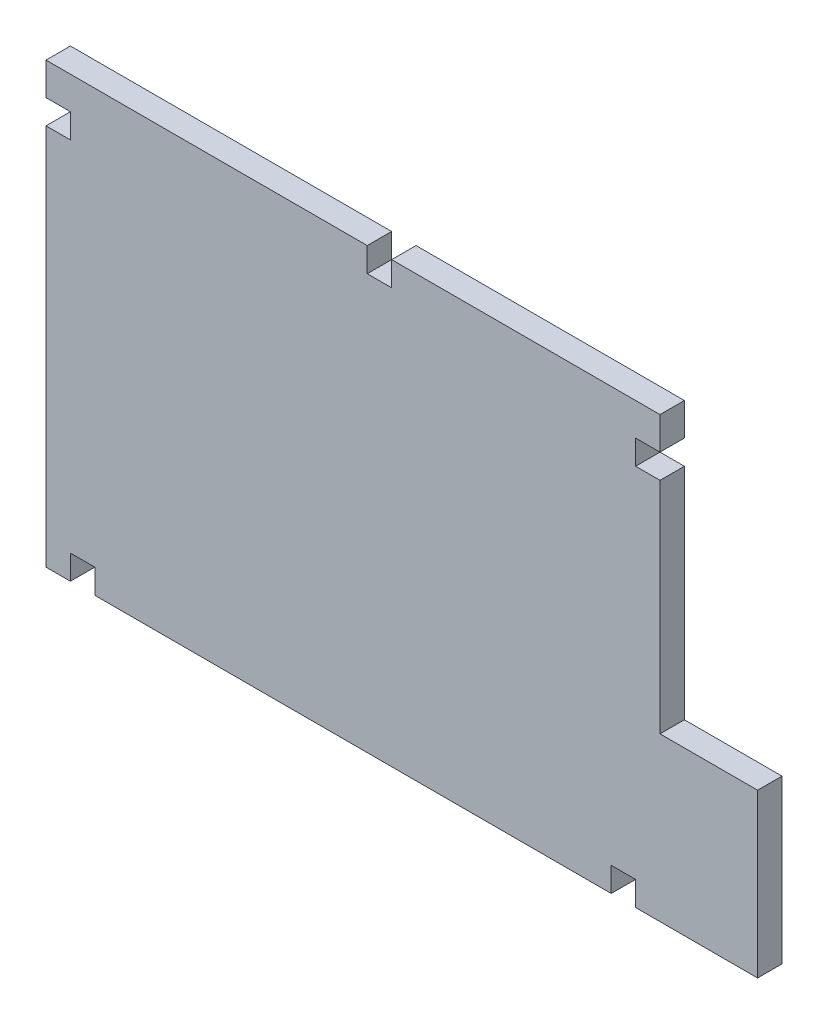
ISO-10303-21;
HEADER;
FILE_DESCRIPTION(('STEP AP214'),'2;1');
FILE_NAME('part.step','',(''),(''),'','','');
FILE_SCHEMA(('AUTOMOTIVE_DESIGN { 1 0 10303 214 1 1 1 1 }'));
ENDSEC;
DATA;
#1=APPLICATION_CONTEXT('core data for automotive mechanical design processes');
#2=APPLICATION_PROTOCOL_DEFINITION('international standard','automotive_design',2000,#1);
#3=PRODUCT_CONTEXT('',#1,'mechanical');
#4=PRODUCT('Part','Part','',(#3));
#5=PRODUCT_RELATED_PRODUCT_CATEGORY('part','',(#4));
#6=PRODUCT_DEFINITION_FORMATION('','',#4);
#7=PRODUCT_DEFINITION_CONTEXT('part definition',#1,'design');
#8=PRODUCT_DEFINITION('design','',#6,#7);
#9=PRODUCT_DEFINITION_SHAPE('','',#8);
#10=(LENGTH_UNIT() NAMED_UNIT(*) SI_UNIT(.MILLI.,.METRE.));
#11=(NAMED_UNIT(*) PLANE_ANGLE_UNIT() SI_UNIT($,.RADIAN.));
#12=(NAMED_UNIT(*) SI_UNIT($,.STERADIAN.) SOLID_ANGLE_UNIT());
#13=UNCERTAINTY_MEASURE_WITH_UNIT(LENGTH_MEASURE(1.E-05),#10,'distance_accuracy_value','');
#14=(GEOMETRIC_REPRESENTATION_CONTEXT(3) GLOBAL_UNCERTAINTY_ASSIGNED_CONTEXT((#13)) GLOBAL_UNIT_ASSIGNED_CONTEXT((#10,
#11,#12)) REPRESENTATION_CONTEXT('',''));
#15=CARTESIAN_POINT('',(0.,0.,0.));
#16=DIRECTION('',(0.,0.,1.));
#17=DIRECTION('',(1.,0.,0.));
#18=AXIS2_PLACEMENT_3D('',#15,#16,#17);
#19=CARTESIAN_POINT('',(0.,0.,3.));
#20=DIRECTION('',(0.,-1.,0.));
#21=DIRECTION('',(0.,0.,-1.));
#22=AXIS2_PLACEMENT_3D('',#19,#20,#21);
#23=PLANE('',#22);
#24=DIRECTION('',(-1.,0.,0.));
#25=VECTOR('',#24,1.);
#26=CARTESIAN_POINT('',(0.,0.,0.));
#27=LINE('',#26,#25);
#28=CARTESIAN_POINT('',(39.5,0.,0.));
#29=VERTEX_POINT('',#28);
#30=CARTESIAN_POINT('',(0.,0.,0.));
#31=VERTEX_POINT('',#30);
#32=EDGE_CURVE('E243',#29,#31,#27,.T.);
#33=ORIENTED_EDGE('',*,*,#32,.T.);
#34=DIRECTION('',(0.,0.,-1.));
#35=VECTOR('',#34,1.);
#36=CARTESIAN_POINT('',(0.,0.,3.));
#37=LINE('',#36,#35);
#38=CARTESIAN_POINT('',(0.,0.,3.));
#39=VERTEX_POINT('',#38);
#40=EDGE_CURVE('E11',#39,#31,#37,.T.);
#41=ORIENTED_EDGE('',*,*,#40,.F.);
#42=DIRECTION('',(-1.,0.,0.));
#43=VECTOR('',#42,1.);
#44=CARTESIAN_POINT('',(0.,0.,3.));
#45=LINE('',#44,#43);
#46=CARTESIAN_POINT('',(39.5,0.,3.));
#47=VERTEX_POINT('',#46);
#48=EDGE_CURVE('E293',#47,#39,#45,.T.);
#49=ORIENTED_EDGE('',*,*,#48,.F.);
#50=DIRECTION('',(0.,0.,-1.));
#51=VECTOR('',#50,1.);
#52=CARTESIAN_POINT('',(39.5,0.,3.));
#53=LINE('',#52,#51);
#54=EDGE_CURVE('E239',#47,#29,#53,.T.);
#55=ORIENTED_EDGE('',*,*,#54,.T.);
#56=EDGE_LOOP('',(#33,#41,#49,#55));
#57=FACE_BOUND('',#56,.T.);
#58=ADVANCED_FACE('F39',(#57),#23,.F.);
#59=CARTESIAN_POINT('',(0.,0.,3.));
#60=DIRECTION('',(1.,0.,0.));
#61=DIRECTION('',(0.,0.,-1.));
#62=AXIS2_PLACEMENT_3D('',#59,#60,#61);
#63=PLANE('',#62);
#64=DIRECTION('',(0.,-1.,0.));
#65=VECTOR('',#64,1.);
#66=CARTESIAN_POINT('',(0.,0.,0.));
#67=LINE('',#66,#65);
#68=CARTESIAN_POINT('',(0.,-4.,0.));
#69=VERTEX_POINT('',#68);
#70=EDGE_CURVE('E246',#31,#69,#67,.T.);
#71=ORIENTED_EDGE('',*,*,#70,.T.);
#72=DIRECTION('',(0.,0.,-1.));
#73=VECTOR('',#72,1.);
#74=CARTESIAN_POINT('',(0.,-4.,3.));
#75=LINE('',#74,#73);
#76=CARTESIAN_POINT('',(0.,-4.,3.));
#77=VERTEX_POINT('',#76);
#78=EDGE_CURVE('E47',#77,#69,#75,.T.);
#79=ORIENTED_EDGE('',*,*,#78,.F.);
#80=DIRECTION('',(0.,-1.,0.));
#81=VECTOR('',#80,1.);
#82=CARTESIAN_POINT('',(0.,0.,3.));
#83=LINE('',#82,#81);
#84=EDGE_CURVE('E152',#39,#77,#83,.T.);
#85=ORIENTED_EDGE('',*,*,#84,.F.);
#86=ORIENTED_EDGE('',*,*,#40,.T.);
#87=EDGE_LOOP('',(#71,#79,#85,#86));
#88=FACE_BOUND('',#87,.T.);
#89=ADVANCED_FACE('F441',(#88),#63,.F.);
#90=CARTESIAN_POINT('',(0.,-4.,3.));
#91=DIRECTION('',(0.,1.,0.));
#92=DIRECTION('',(0.,0.,1.));
#93=AXIS2_PLACEMENT_3D('',#90,#91,#92);
#94=PLANE('',#93);
#95=DIRECTION('',(1.,0.,0.));
#96=VECTOR('',#95,1.);
#97=CARTESIAN_POINT('',(0.,-4.,0.));
#98=LINE('',#97,#96);
#99=CARTESIAN_POINT('',(3.,-4.,0.));
#100=VERTEX_POINT('',#99);
#101=EDGE_CURVE('E248',#69,#100,#98,.T.);
#102=ORIENTED_EDGE('',*,*,#101,.T.);
#103=DIRECTION('',(0.,0.,-1.));
#104=VECTOR('',#103,1.);
#105=CARTESIAN_POINT('',(3.,-4.,3.));
#106=LINE('',#105,#104);
#107=CARTESIAN_POINT('',(3.,-4.,3.));
#108=VERTEX_POINT('',#107);
#109=EDGE_CURVE('E354',#108,#100,#106,.T.);
#110=ORIENTED_EDGE('',*,*,#109,.F.);
#111=DIRECTION('',(1.,0.,0.));
#112=VECTOR('',#111,1.);
#113=CARTESIAN_POINT('',(0.,-4.,3.));
#114=LINE('',#113,#112);
#115=EDGE_CURVE('E362',#77,#108,#114,.T.);
#116=ORIENTED_EDGE('',*,*,#115,.F.);
#117=ORIENTED_EDGE('',*,*,#78,.T.);
#118=EDGE_LOOP('',(#102,#110,#116,#117));
#119=FACE_BOUND('',#118,.T.);
#120=ADVANCED_FACE('F360',(#119),#94,.F.);
#121=CARTESIAN_POINT('',(3.,-4.,3.));
#122=DIRECTION('',(1.,0.,0.));
#123=DIRECTION('',(0.,0.,-1.));
#124=AXIS2_PLACEMENT_3D('',#121,#122,#123);
#125=PLANE('',#124);
#126=DIRECTION('',(0.,-1.,0.));
#127=VECTOR('',#126,1.);
#128=CARTESIAN_POINT('',(3.,-4.,0.));
#129=LINE('',#128,#127);
#130=CARTESIAN_POINT('',(3.,-7.,0.));
#131=VERTEX_POINT('',#130);
#132=EDGE_CURVE('E250',#100,#131,#129,.T.);
#133=ORIENTED_EDGE('',*,*,#132,.T.);
#134=DIRECTION('',(0.,0.,-1.));
#135=VECTOR('',#134,1.);
#136=CARTESIAN_POINT('',(3.,-7.,3.));
#137=LINE('',#136,#135);
#138=CARTESIAN_POINT('',(3.,-7.,3.));
#139=VERTEX_POINT('',#138);
#140=EDGE_CURVE('E351',#139,#131,#137,.T.);
#141=ORIENTED_EDGE('',*,*,#140,.F.);
#142=DIRECTION('',(0.,-1.,0.));
#143=VECTOR('',#142,1.);
#144=CARTESIAN_POINT('',(3.,-4.,3.));
#145=LINE('',#144,#143);
#146=EDGE_CURVE('E380',#108,#139,#145,.T.);
#147=ORIENTED_EDGE('',*,*,#146,.F.);
#148=ORIENTED_EDGE('',*,*,#109,.T.);
#149=EDGE_LOOP('',(#133,#141,#147,#148));
#150=FACE_BOUND('',#149,.T.);
#151=ADVANCED_FACE('F371',(#150),#125,.F.);
#152=CARTESIAN_POINT('',(3.,-7.,3.));
#153=DIRECTION('',(0.,-1.,0.));
#154=DIRECTION('',(0.,0.,-1.));
#155=AXIS2_PLACEMENT_3D('',#152,#153,#154);
#156=PLANE('',#155);
#157=DIRECTION('',(-1.,0.,0.));
#158=VECTOR('',#157,1.);
#159=CARTESIAN_POINT('',(3.,-7.,0.));
#160=LINE('',#159,#158);
#161=CARTESIAN_POINT('',(0.,-7.,0.));
#162=VERTEX_POINT('',#161);
#163=EDGE_CURVE('E252',#131,#162,#160,.T.);
#164=ORIENTED_EDGE('',*,*,#163,.T.);
#165=DIRECTION('',(0.,0.,-1.));
#166=VECTOR('',#165,1.);
#167=CARTESIAN_POINT('',(0.,-7.,3.));
#168=LINE('',#167,#166);
#169=CARTESIAN_POINT('',(0.,-7.,3.));
#170=VERTEX_POINT('',#169);
#171=EDGE_CURVE('E348',#170,#162,#168,.T.);
#172=ORIENTED_EDGE('',*,*,#171,.F.);
#173=DIRECTION('',(-1.,0.,0.));
#174=VECTOR('',#173,1.);
#175=CARTESIAN_POINT('',(3.,-7.,3.));
#176=LINE('',#175,#174);
#177=EDGE_CURVE('E377',#139,#170,#176,.T.);
#178=ORIENTED_EDGE('',*,*,#177,.F.);
#179=ORIENTED_EDGE('',*,*,#140,.T.);
#180=EDGE_LOOP('',(#164,#172,#178,#179));
#181=FACE_BOUND('',#180,.T.);
#182=ADVANCED_FACE('F375',(#181),#156,.F.);
#183=CARTESIAN_POINT('',(0.,-7.,3.));
#184=DIRECTION('',(1.,0.,0.));
#185=DIRECTION('',(0.,0.,-1.));
#186=AXIS2_PLACEMENT_3D('',#183,#184,#185);
#187=PLANE('',#186);
#188=DIRECTION('',(0.,-1.,0.));
#189=VECTOR('',#188,1.);
#190=CARTESIAN_POINT('',(0.,-7.,0.));
#191=LINE('',#190,#189);
#192=CARTESIAN_POINT('',(0.,-54.,0.));
#193=VERTEX_POINT('',#192);
#194=EDGE_CURVE('E254',#162,#193,#191,.T.);
#195=ORIENTED_EDGE('',*,*,#194,.T.);
#196=DIRECTION('',(0.,0.,-1.));
#197=VECTOR('',#196,1.);
#198=CARTESIAN_POINT('',(0.,-54.,3.));
#199=LINE('',#198,#197);
#200=CARTESIAN_POINT('',(0.,-54.,3.));
#201=VERTEX_POINT('',#200);
#202=EDGE_CURVE('E345',#201,#193,#199,.T.);
#203=ORIENTED_EDGE('',*,*,#202,.F.);
#204=DIRECTION('',(0.,-1.,0.));
#205=VECTOR('',#204,1.);
#206=CARTESIAN_POINT('',(0.,-7.,3.));
#207=LINE('',#206,#205);
#208=EDGE_CURVE('E379',#170,#201,#207,.T.);
#209=ORIENTED_EDGE('',*,*,#208,.F.);
#210=ORIENTED_EDGE('',*,*,#171,.T.);
#211=EDGE_LOOP('',(#195,#203,#209,#210));
#212=FACE_BOUND('',#211,.T.);
#213=ADVANCED_FACE('F454',(#212),#187,.F.);
#214=CARTESIAN_POINT('',(0.,-54.,3.));
#215=DIRECTION('',(0.,1.,0.));
#216=DIRECTION('',(0.,0.,1.));
#217=AXIS2_PLACEMENT_3D('',#214,#215,#216);
#218=PLANE('',#217);
#219=DIRECTION('',(1.,0.,0.));
#220=VECTOR('',#219,1.);
#221=CARTESIAN_POINT('',(0.,-54.,0.));
#222=LINE('',#221,#220);
#223=CARTESIAN_POINT('',(3.,-54.,0.));
#224=VERTEX_POINT('',#223);
#225=EDGE_CURVE('E256',#193,#224,#222,.T.);
#226=ORIENTED_EDGE('',*,*,#225,.T.);
#227=DIRECTION('',(0.,0.,-1.));
#228=VECTOR('',#227,1.);
#229=CARTESIAN_POINT('',(3.,-54.,3.));
#230=LINE('',#229,#228);
#231=CARTESIAN_POINT('',(3.,-54.,3.));
#232=VERTEX_POINT('',#231);
#233=EDGE_CURVE('E342',#232,#224,#230,.T.);
#234=ORIENTED_EDGE('',*,*,#233,.F.);
#235=DIRECTION('',(1.,0.,0.));
#236=VECTOR('',#235,1.);
#237=CARTESIAN_POINT('',(0.,-54.,3.));
#238=LINE('',#237,#236);
#239=EDGE_CURVE('E382',#201,#232,#238,.T.);
#240=ORIENTED_EDGE('',*,*,#239,.F.);
#241=ORIENTED_EDGE('',*,*,#202,.T.);
#242=EDGE_LOOP('',(#226,#234,#240,#241));
#243=FACE_BOUND('',#242,.T.);
#244=ADVANCED_FACE('F457',(#243),#218,.F.);
#245=CARTESIAN_POINT('',(3.,-54.,3.));
#246=DIRECTION('',(-1.,0.,0.));
#247=DIRECTION('',(0.,0.,1.));
#248=AXIS2_PLACEMENT_3D('',#245,#246,#247);
#249=PLANE('',#248);
#250=DIRECTION('',(0.,1.,0.));
#251=VECTOR('',#250,1.);
#252=CARTESIAN_POINT('',(3.,-54.,0.));
#253=LINE('',#252,#251);
#254=CARTESIAN_POINT('',(3.,-51.,0.));
#255=VERTEX_POINT('',#254);
#256=EDGE_CURVE('E258',#224,#255,#253,.T.);
#257=ORIENTED_EDGE('',*,*,#256,.T.);
#258=DIRECTION('',(0.,0.,-1.));
#259=VECTOR('',#258,1.);
#260=CARTESIAN_POINT('',(3.,-51.,3.));
#261=LINE('',#260,#259);
#262=CARTESIAN_POINT('',(3.,-51.,3.));
#263=VERTEX_POINT('',#262);
#264=EDGE_CURVE('E339',#263,#255,#261,.T.);
#265=ORIENTED_EDGE('',*,*,#264,.F.);
#266=DIRECTION('',(0.,1.,0.));
#267=VECTOR('',#266,1.);
#268=CARTESIAN_POINT('',(3.,-54.,3.));
#269=LINE('',#268,#267);
#270=EDGE_CURVE('E388',#232,#263,#269,.T.);
#271=ORIENTED_EDGE('',*,*,#270,.F.);
#272=ORIENTED_EDGE('',*,*,#233,.T.);
#273=EDGE_LOOP('',(#257,#265,#271,#272));
#274=FACE_BOUND('',#273,.T.);
#275=ADVANCED_FACE('F461',(#274),#249,.F.);
#276=CARTESIAN_POINT('',(3.,-51.,3.));
#277=DIRECTION('',(0.,1.,0.));
#278=DIRECTION('',(0.,0.,1.));
#279=AXIS2_PLACEMENT_3D('',#276,#277,#278);
#280=PLANE('',#279);
#281=DIRECTION('',(1.,0.,0.));
#282=VECTOR('',#281,1.);
#283=CARTESIAN_POINT('',(3.,-51.,0.));
#284=LINE('',#283,#282);
#285=CARTESIAN_POINT('',(6.,-51.,0.));
#286=VERTEX_POINT('',#285);
#287=EDGE_CURVE('E260',#255,#286,#284,.T.);
#288=ORIENTED_EDGE('',*,*,#287,.T.);
#289=DIRECTION('',(0.,0.,-1.));
#290=VECTOR('',#289,1.);
#291=CARTESIAN_POINT('',(6.,-51.,3.));
#292=LINE('',#291,#290);
#293=CARTESIAN_POINT('',(6.,-51.,3.));
#294=VERTEX_POINT('',#293);
#295=EDGE_CURVE('E336',#294,#286,#292,.T.);
#296=ORIENTED_EDGE('',*,*,#295,.F.);
#297=DIRECTION('',(1.,0.,0.));
#298=VECTOR('',#297,1.);
#299=CARTESIAN_POINT('',(3.,-51.,3.));
#300=LINE('',#299,#298);
#301=EDGE_CURVE('E390',#263,#294,#300,.T.);
#302=ORIENTED_EDGE('',*,*,#301,.F.);
#303=ORIENTED_EDGE('',*,*,#264,.T.);
#304=EDGE_LOOP('',(#288,#296,#302,#303));
#305=FACE_BOUND('',#304,.T.);
#306=ADVANCED_FACE('F465',(#305),#280,.F.);
#307=CARTESIAN_POINT('',(6.,-51.,3.));
#308=DIRECTION('',(1.,0.,0.));
#309=DIRECTION('',(0.,0.,-1.));
#310=AXIS2_PLACEMENT_3D('',#307,#308,#309);
#311=PLANE('',#310);
#312=DIRECTION('',(0.,-1.,0.));
#313=VECTOR('',#312,1.);
#314=CARTESIAN_POINT('',(6.,-51.,0.));
#315=LINE('',#314,#313);
#316=CARTESIAN_POINT('',(6.,-54.,0.));
#317=VERTEX_POINT('',#316);
#318=EDGE_CURVE('E262',#286,#317,#315,.T.);
#319=ORIENTED_EDGE('',*,*,#318,.T.);
#320=DIRECTION('',(0.,0.,-1.));
#321=VECTOR('',#320,1.);
#322=CARTESIAN_POINT('',(6.,-54.,3.));
#323=LINE('',#322,#321);
#324=CARTESIAN_POINT('',(6.,-54.,3.));
#325=VERTEX_POINT('',#324);
#326=EDGE_CURVE('E333',#325,#317,#323,.T.);
#327=ORIENTED_EDGE('',*,*,#326,.F.);
#328=DIRECTION('',(0.,-1.,0.));
#329=VECTOR('',#328,1.);
#330=CARTESIAN_POINT('',(6.,-51.,3.));
#331=LINE('',#330,#329);
#332=EDGE_CURVE('E392',#294,#325,#331,.T.);
#333=ORIENTED_EDGE('',*,*,#332,.F.);
#334=ORIENTED_EDGE('',*,*,#295,.T.);
#335=EDGE_LOOP('',(#319,#327,#333,#334));
#336=FACE_BOUND('',#335,.T.);
#337=ADVANCED_FACE('F469',(#336),#311,.F.);
#338=CARTESIAN_POINT('',(6.,-54.,3.));
#339=DIRECTION('',(0.,1.,0.));
#340=DIRECTION('',(0.,0.,1.));
#341=AXIS2_PLACEMENT_3D('',#338,#339,#340);
#342=PLANE('',#341);
#343=DIRECTION('',(1.,0.,0.));
#344=VECTOR('',#343,1.);
#345=CARTESIAN_POINT('',(6.,-54.,0.));
#346=LINE('',#345,#344);
#347=CARTESIAN_POINT('',(69.5,-54.,0.));
#348=VERTEX_POINT('',#347);
#349=EDGE_CURVE('E264',#317,#348,#346,.T.);
#350=ORIENTED_EDGE('',*,*,#349,.T.);
#351=DIRECTION('',(0.,0.,-1.));
#352=VECTOR('',#351,1.);
#353=CARTESIAN_POINT('',(69.5,-54.,3.));
#354=LINE('',#353,#352);
#355=CARTESIAN_POINT('',(69.5,-54.,3.));
#356=VERTEX_POINT('',#355);
#357=EDGE_CURVE('E330',#356,#348,#354,.T.);
#358=ORIENTED_EDGE('',*,*,#357,.F.);
#359=DIRECTION('',(1.,0.,0.));
#360=VECTOR('',#359,1.);
#361=CARTESIAN_POINT('',(6.,-54.,3.));
#362=LINE('',#361,#360);
#363=EDGE_CURVE('E394',#325,#356,#362,.T.);
#364=ORIENTED_EDGE('',*,*,#363,.F.);
#365=ORIENTED_EDGE('',*,*,#326,.T.);
#366=EDGE_LOOP('',(#350,#358,#364,#365));
#367=FACE_BOUND('',#366,.T.);
#368=ADVANCED_FACE('F473',(#367),#342,.F.);
#369=CARTESIAN_POINT('',(69.5,-54.,3.));
#370=DIRECTION('',(-1.,0.,0.));
#371=DIRECTION('',(0.,0.,1.));
#372=AXIS2_PLACEMENT_3D('',#369,#370,#371);
#373=PLANE('',#372);
#374=DIRECTION('',(0.,1.,0.));
#375=VECTOR('',#374,1.);
#376=CARTESIAN_POINT('',(69.5,-54.,0.));
#377=LINE('',#376,#375);
#378=CARTESIAN_POINT('',(69.5,-51.,0.));
#379=VERTEX_POINT('',#378);
#380=EDGE_CURVE('E266',#348,#379,#377,.T.);
#381=ORIENTED_EDGE('',*,*,#380,.T.);
#382=DIRECTION('',(0.,0.,-1.));
#383=VECTOR('',#382,1.);
#384=CARTESIAN_POINT('',(69.5,-51.,3.));
#385=LINE('',#384,#383);
#386=CARTESIAN_POINT('',(69.5,-51.,3.));
#387=VERTEX_POINT('',#386);
#388=EDGE_CURVE('E327',#387,#379,#385,.T.);
#389=ORIENTED_EDGE('',*,*,#388,.F.);
#390=DIRECTION('',(0.,1.,0.));
#391=VECTOR('',#390,1.);
#392=CARTESIAN_POINT('',(69.5,-54.,3.));
#393=LINE('',#392,#391);
#394=EDGE_CURVE('E396',#356,#387,#393,.T.);
#395=ORIENTED_EDGE('',*,*,#394,.F.);
#396=ORIENTED_EDGE('',*,*,#357,.T.);
#397=EDGE_LOOP('',(#381,#389,#395,#396));
#398=FACE_BOUND('',#397,.T.);
#399=ADVANCED_FACE('F477',(#398),#373,.F.);
#400=CARTESIAN_POINT('',(69.5,-51.,3.));
#401=DIRECTION('',(0.,1.,0.));
#402=DIRECTION('',(0.,0.,1.));
#403=AXIS2_PLACEMENT_3D('',#400,#401,#402);
#404=PLANE('',#403);
#405=DIRECTION('',(1.,0.,0.));
#406=VECTOR('',#405,1.);
#407=CARTESIAN_POINT('',(69.5,-51.,0.));
#408=LINE('',#407,#406);
#409=CARTESIAN_POINT('',(72.5,-51.,0.));
#410=VERTEX_POINT('',#409);
#411=EDGE_CURVE('E268',#379,#410,#408,.T.);
#412=ORIENTED_EDGE('',*,*,#411,.T.);
#413=DIRECTION('',(0.,0.,-1.));
#414=VECTOR('',#413,1.);
#415=CARTESIAN_POINT('',(72.5,-51.,3.));
#416=LINE('',#415,#414);
#417=CARTESIAN_POINT('',(72.5,-51.,3.));
#418=VERTEX_POINT('',#417);
#419=EDGE_CURVE('E324',#418,#410,#416,.T.);
#420=ORIENTED_EDGE('',*,*,#419,.F.);
#421=DIRECTION('',(1.,0.,0.));
#422=VECTOR('',#421,1.);
#423=CARTESIAN_POINT('',(69.5,-51.,3.));
#424=LINE('',#423,#422);
#425=EDGE_CURVE('E398',#387,#418,#424,.T.);
#426=ORIENTED_EDGE('',*,*,#425,.F.);
#427=ORIENTED_EDGE('',*,*,#388,.T.);
#428=EDGE_LOOP('',(#412,#420,#426,#427));
#429=FACE_BOUND('',#428,.T.);
#430=ADVANCED_FACE('F481',(#429),#404,.F.);
#431=CARTESIAN_POINT('',(72.5,-51.,3.));
#432=DIRECTION('',(1.,0.,0.));
#433=DIRECTION('',(0.,0.,-1.));
#434=AXIS2_PLACEMENT_3D('',#431,#432,#433);
#435=PLANE('',#434);
#436=DIRECTION('',(0.,-1.,0.));
#437=VECTOR('',#436,1.);
#438=CARTESIAN_POINT('',(72.5,-51.,0.));
#439=LINE('',#438,#437);
#440=CARTESIAN_POINT('',(72.5,-54.,0.));
#441=VERTEX_POINT('',#440);
#442=EDGE_CURVE('E270',#410,#441,#439,.T.);
#443=ORIENTED_EDGE('',*,*,#442,.T.);
#444=DIRECTION('',(0.,0.,-1.));
#445=VECTOR('',#444,1.);
#446=CARTESIAN_POINT('',(72.5,-54.,3.));
#447=LINE('',#446,#445);
#448=CARTESIAN_POINT('',(72.5,-54.,3.));
#449=VERTEX_POINT('',#448);
#450=EDGE_CURVE('E321',#449,#441,#447,.T.);
#451=ORIENTED_EDGE('',*,*,#450,.F.);
#452=DIRECTION('',(0.,-1.,0.));
#453=VECTOR('',#452,1.);
#454=CARTESIAN_POINT('',(72.5,-51.,3.));
#455=LINE('',#454,#453);
#456=EDGE_CURVE('E400',#418,#449,#455,.T.);
#457=ORIENTED_EDGE('',*,*,#456,.F.);
#458=ORIENTED_EDGE('',*,*,#419,.T.);
#459=EDGE_LOOP('',(#443,#451,#457,#458));
#460=FACE_BOUND('',#459,.T.);
#461=ADVANCED_FACE('F485',(#460),#435,.F.);
#462=CARTESIAN_POINT('',(72.5,-54.,3.));
#463=DIRECTION('',(0.,1.,0.));
#464=DIRECTION('',(0.,0.,1.));
#465=AXIS2_PLACEMENT_3D('',#462,#463,#464);
#466=PLANE('',#465);
#467=DIRECTION('',(1.,0.,0.));
#468=VECTOR('',#467,1.);
#469=CARTESIAN_POINT('',(72.5,-54.,0.));
#470=LINE('',#469,#468);
#471=CARTESIAN_POINT('',(87.5,-54.,0.));
#472=VERTEX_POINT('',#471);
#473=EDGE_CURVE('E272',#441,#472,#470,.T.);
#474=ORIENTED_EDGE('',*,*,#473,.T.);
#475=DIRECTION('',(0.,0.,-1.));
#476=VECTOR('',#475,1.);
#477=CARTESIAN_POINT('',(87.5,-54.,3.));
#478=LINE('',#477,#476);
#479=CARTESIAN_POINT('',(87.5,-54.,3.));
#480=VERTEX_POINT('',#479);
#481=EDGE_CURVE('E318',#480,#472,#478,.T.);
#482=ORIENTED_EDGE('',*,*,#481,.F.);
#483=DIRECTION('',(1.,0.,0.));
#484=VECTOR('',#483,1.);
#485=CARTESIAN_POINT('',(72.5,-54.,3.));
#486=LINE('',#485,#484);
#487=EDGE_CURVE('E402',#449,#480,#486,.T.);
#488=ORIENTED_EDGE('',*,*,#487,.F.);
#489=ORIENTED_EDGE('',*,*,#450,.T.);
#490=EDGE_LOOP('',(#474,#482,#488,#489));
#491=FACE_BOUND('',#490,.T.);
#492=ADVANCED_FACE('F489',(#491),#466,.F.);
#493=CARTESIAN_POINT('',(87.5,-54.,3.));
#494=DIRECTION('',(-1.,0.,0.));
#495=DIRECTION('',(0.,0.,1.));
#496=AXIS2_PLACEMENT_3D('',#493,#494,#495);
#497=PLANE('',#496);
#498=DIRECTION('',(0.,1.,0.));
#499=VECTOR('',#498,1.);
#500=CARTESIAN_POINT('',(87.5,-54.,0.));
#501=LINE('',#500,#499);
#502=CARTESIAN_POINT('',(87.5,-34.,0.));
#503=VERTEX_POINT('',#502);
#504=EDGE_CURVE('E274',#472,#503,#501,.T.);
#505=ORIENTED_EDGE('',*,*,#504,.T.);
#506=DIRECTION('',(0.,0.,-1.));
#507=VECTOR('',#506,1.);
#508=CARTESIAN_POINT('',(87.5,-34.,3.));
#509=LINE('',#508,#507);
#510=CARTESIAN_POINT('',(87.5,-34.,3.));
#511=VERTEX_POINT('',#510);
#512=EDGE_CURVE('E315',#511,#503,#509,.T.);
#513=ORIENTED_EDGE('',*,*,#512,.F.);
#514=DIRECTION('',(0.,1.,0.));
#515=VECTOR('',#514,1.);
#516=CARTESIAN_POINT('',(87.5,-54.,3.));
#517=LINE('',#516,#515);
#518=EDGE_CURVE('E404',#480,#511,#517,.T.);
#519=ORIENTED_EDGE('',*,*,#518,.F.);
#520=ORIENTED_EDGE('',*,*,#481,.T.);
#521=EDGE_LOOP('',(#505,#513,#519,#520));
#522=FACE_BOUND('',#521,.T.);
#523=ADVANCED_FACE('F493',(#522),#497,.F.);
#524=CARTESIAN_POINT('',(87.5,-34.,3.));
#525=DIRECTION('',(0.,-1.,0.));
#526=DIRECTION('',(0.,0.,-1.));
#527=AXIS2_PLACEMENT_3D('',#524,#525,#526);
#528=PLANE('',#527);
#529=DIRECTION('',(-1.,0.,0.));
#530=VECTOR('',#529,1.);
#531=CARTESIAN_POINT('',(87.5,-34.,0.));
#532=LINE('',#531,#530);
#533=CARTESIAN_POINT('',(75.5,-34.,0.));
#534=VERTEX_POINT('',#533);
#535=EDGE_CURVE('E276',#503,#534,#532,.T.);
#536=ORIENTED_EDGE('',*,*,#535,.T.);
#537=DIRECTION('',(0.,0.,-1.));
#538=VECTOR('',#537,1.);
#539=CARTESIAN_POINT('',(75.5,-34.,3.));
#540=LINE('',#539,#538);
#541=CARTESIAN_POINT('',(75.5,-34.,3.));
#542=VERTEX_POINT('',#541);
#543=EDGE_CURVE('E312',#542,#534,#540,.T.);
#544=ORIENTED_EDGE('',*,*,#543,.F.);
#545=DIRECTION('',(-1.,0.,0.));
#546=VECTOR('',#545,1.);
#547=CARTESIAN_POINT('',(87.5,-34.,3.));
#548=LINE('',#547,#546);
#549=EDGE_CURVE('E406',#511,#542,#548,.T.);
#550=ORIENTED_EDGE('',*,*,#549,.F.);
#551=ORIENTED_EDGE('',*,*,#512,.T.);
#552=EDGE_LOOP('',(#536,#544,#550,#551));
#553=FACE_BOUND('',#552,.T.);
#554=ADVANCED_FACE('F497',(#553),#528,.F.);
#555=CARTESIAN_POINT('',(75.5,-7.,3.));
#556=DIRECTION('',(-1.,0.,0.));
#557=DIRECTION('',(0.,0.,1.));
#558=AXIS2_PLACEMENT_3D('',#555,#556,#557);
#559=PLANE('',#558);
#560=DIRECTION('',(0.,1.,0.));
#561=VECTOR('',#560,1.);
#562=CARTESIAN_POINT('',(75.5,-7.,0.));
#563=LINE('',#562,#561);
#564=CARTESIAN_POINT('',(75.5,-7.,0.));
#565=VERTEX_POINT('',#564);
#566=EDGE_CURVE('E278',#534,#565,#563,.T.);
#567=ORIENTED_EDGE('',*,*,#566,.T.);
#568=DIRECTION('',(0.,0.,-1.));
#569=VECTOR('',#568,1.);
#570=CARTESIAN_POINT('',(75.5,-7.,3.));
#571=LINE('',#570,#569);
#572=CARTESIAN_POINT('',(75.5,-7.,3.));
#573=VERTEX_POINT('',#572);
#574=EDGE_CURVE('E309',#573,#565,#571,.T.);
#575=ORIENTED_EDGE('',*,*,#574,.F.);
#576=DIRECTION('',(0.,1.,0.));
#577=VECTOR('',#576,1.);
#578=CARTESIAN_POINT('',(75.5,-7.,3.));
#579=LINE('',#578,#577);
#580=EDGE_CURVE('E408',#542,#573,#579,.T.);
#581=ORIENTED_EDGE('',*,*,#580,.F.);
#582=ORIENTED_EDGE('',*,*,#543,.T.);
#583=EDGE_LOOP('',(#567,#575,#581,#582));
#584=FACE_BOUND('',#583,.T.);
#585=ADVANCED_FACE('F501',(#584),#559,.F.);
#586=CARTESIAN_POINT('',(72.5,-7.,3.));
#587=DIRECTION('',(0.,-1.,0.));
#588=DIRECTION('',(0.,0.,-1.));
#589=AXIS2_PLACEMENT_3D('',#586,#587,#588);
#590=PLANE('',#589);
#591=DIRECTION('',(-1.,0.,0.));
#592=VECTOR('',#591,1.);
#593=CARTESIAN_POINT('',(72.5,-7.,0.));
#594=LINE('',#593,#592);
#595=CARTESIAN_POINT('',(72.5,-7.,0.));
#596=VERTEX_POINT('',#595);
#597=EDGE_CURVE('E280',#565,#596,#594,.T.);
#598=ORIENTED_EDGE('',*,*,#597,.T.);
#599=DIRECTION('',(0.,0.,-1.));
#600=VECTOR('',#599,1.);
#601=CARTESIAN_POINT('',(72.5,-7.,3.));
#602=LINE('',#601,#600);
#603=CARTESIAN_POINT('',(72.5,-7.,3.));
#604=VERTEX_POINT('',#603);
#605=EDGE_CURVE('E306',#604,#596,#602,.T.);
#606=ORIENTED_EDGE('',*,*,#605,.F.);
#607=DIRECTION('',(-1.,0.,0.));
#608=VECTOR('',#607,1.);
#609=CARTESIAN_POINT('',(72.5,-7.,3.));
#610=LINE('',#609,#608);
#611=EDGE_CURVE('E410',#573,#604,#610,.T.);
#612=ORIENTED_EDGE('',*,*,#611,.F.);
#613=ORIENTED_EDGE('',*,*,#574,.T.);
#614=EDGE_LOOP('',(#598,#606,#612,#613));
#615=FACE_BOUND('',#614,.T.);
#616=ADVANCED_FACE('F505',(#615),#590,.F.);
#617=CARTESIAN_POINT('',(72.5,-4.,3.));
#618=DIRECTION('',(-1.,0.,0.));
#619=DIRECTION('',(0.,0.,1.));
#620=AXIS2_PLACEMENT_3D('',#617,#618,#619);
#621=PLANE('',#620);
#622=DIRECTION('',(0.,1.,0.));
#623=VECTOR('',#622,1.);
#624=CARTESIAN_POINT('',(72.5,-4.,0.));
#625=LINE('',#624,#623);
#626=CARTESIAN_POINT('',(72.5,-4.,0.));
#627=VERTEX_POINT('',#626);
#628=EDGE_CURVE('E282',#596,#627,#625,.T.);
#629=ORIENTED_EDGE('',*,*,#628,.T.);
#630=DIRECTION('',(0.,0.,-1.));
#631=VECTOR('',#630,1.);
#632=CARTESIAN_POINT('',(72.5,-4.,3.));
#633=LINE('',#632,#631);
#634=CARTESIAN_POINT('',(72.5,-4.,3.));
#635=VERTEX_POINT('',#634);
#636=EDGE_CURVE('E303',#635,#627,#633,.T.);
#637=ORIENTED_EDGE('',*,*,#636,.F.);
#638=DIRECTION('',(0.,1.,0.));
#639=VECTOR('',#638,1.);
#640=CARTESIAN_POINT('',(72.5,-4.,3.));
#641=LINE('',#640,#639);
#642=EDGE_CURVE('E412',#604,#635,#641,.T.);
#643=ORIENTED_EDGE('',*,*,#642,.F.);
#644=ORIENTED_EDGE('',*,*,#605,.T.);
#645=EDGE_LOOP('',(#629,#637,#643,#644));
#646=FACE_BOUND('',#645,.T.);
#647=ADVANCED_FACE('F509',(#646),#621,.F.);
#648=CARTESIAN_POINT('',(75.5,-4.,3.));
#649=DIRECTION('',(0.,1.,0.));
#650=DIRECTION('',(0.,0.,1.));
#651=AXIS2_PLACEMENT_3D('',#648,#649,#650);
#652=PLANE('',#651);
#653=DIRECTION('',(1.,0.,0.));
#654=VECTOR('',#653,1.);
#655=CARTESIAN_POINT('',(75.5,-4.,0.));
#656=LINE('',#655,#654);
#657=CARTESIAN_POINT('',(75.5,-4.,0.));
#658=VERTEX_POINT('',#657);
#659=EDGE_CURVE('E284',#627,#658,#656,.T.);
#660=ORIENTED_EDGE('',*,*,#659,.T.);
#661=DIRECTION('',(0.,0.,-1.));
#662=VECTOR('',#661,1.);
#663=CARTESIAN_POINT('',(75.5,-4.,3.));
#664=LINE('',#663,#662);
#665=CARTESIAN_POINT('',(75.5,-4.,3.));
#666=VERTEX_POINT('',#665);
#667=EDGE_CURVE('E300',#666,#658,#664,.T.);
#668=ORIENTED_EDGE('',*,*,#667,.F.);
#669=DIRECTION('',(1.,0.,0.));
#670=VECTOR('',#669,1.);
#671=CARTESIAN_POINT('',(75.5,-4.,3.));
#672=LINE('',#671,#670);
#673=EDGE_CURVE('E414',#635,#666,#672,.T.);
#674=ORIENTED_EDGE('',*,*,#673,.F.);
#675=ORIENTED_EDGE('',*,*,#636,.T.);
#676=EDGE_LOOP('',(#660,#668,#674,#675));
#677=FACE_BOUND('',#676,.T.);
#678=ADVANCED_FACE('F513',(#677),#652,.F.);
#679=CARTESIAN_POINT('',(75.5,0.,3.));
#680=DIRECTION('',(-1.,0.,0.));
#681=DIRECTION('',(0.,0.,1.));
#682=AXIS2_PLACEMENT_3D('',#679,#680,#681);
#683=PLANE('',#682);
#684=DIRECTION('',(0.,1.,0.));
#685=VECTOR('',#684,1.);
#686=CARTESIAN_POINT('',(75.5,0.,0.));
#687=LINE('',#686,#685);
#688=CARTESIAN_POINT('',(75.5,0.,0.));
#689=VERTEX_POINT('',#688);
#690=EDGE_CURVE('E286',#658,#689,#687,.T.);
#691=ORIENTED_EDGE('',*,*,#690,.T.);
#692=DIRECTION('',(0.,0.,-1.));
#693=VECTOR('',#692,1.);
#694=CARTESIAN_POINT('',(75.5,0.,3.));
#695=LINE('',#694,#693);
#696=CARTESIAN_POINT('',(75.5,0.,3.));
#697=VERTEX_POINT('',#696);
#698=EDGE_CURVE('E297',#697,#689,#695,.T.);
#699=ORIENTED_EDGE('',*,*,#698,.F.);
#700=DIRECTION('',(0.,1.,0.));
#701=VECTOR('',#700,1.);
#702=CARTESIAN_POINT('',(75.5,0.,3.));
#703=LINE('',#702,#701);
#704=EDGE_CURVE('E416',#666,#697,#703,.T.);
#705=ORIENTED_EDGE('',*,*,#704,.F.);
#706=ORIENTED_EDGE('',*,*,#667,.T.);
#707=EDGE_LOOP('',(#691,#699,#705,#706));
#708=FACE_BOUND('',#707,.T.);
#709=ADVANCED_FACE('F422',(#708),#683,.F.);
#710=CARTESIAN_POINT('',(42.5,0.,3.));
#711=DIRECTION('',(0.,-1.,0.));
#712=DIRECTION('',(0.,0.,-1.));
#713=AXIS2_PLACEMENT_3D('',#710,#711,#712);
#714=PLANE('',#713);
#715=DIRECTION('',(-1.,0.,0.));
#716=VECTOR('',#715,1.);
#717=CARTESIAN_POINT('',(42.5,0.,0.));
#718=LINE('',#717,#716);
#719=CARTESIAN_POINT('',(42.5,0.,0.));
#720=VERTEX_POINT('',#719);
#721=EDGE_CURVE('E288',#689,#720,#718,.T.);
#722=ORIENTED_EDGE('',*,*,#721,.T.);
#723=DIRECTION('',(0.,0.,-1.));
#724=VECTOR('',#723,1.);
#725=CARTESIAN_POINT('',(42.5,0.,3.));
#726=LINE('',#725,#724);
#727=CARTESIAN_POINT('',(42.5,0.,3.));
#728=VERTEX_POINT('',#727);
#729=EDGE_CURVE('E234',#728,#720,#726,.T.);
#730=ORIENTED_EDGE('',*,*,#729,.F.);
#731=DIRECTION('',(-1.,0.,0.));
#732=VECTOR('',#731,1.);
#733=CARTESIAN_POINT('',(42.5,0.,3.));
#734=LINE('',#733,#732);
#735=EDGE_CURVE('E225',#697,#728,#734,.T.);
#736=ORIENTED_EDGE('',*,*,#735,.F.);
#737=ORIENTED_EDGE('',*,*,#698,.T.);
#738=EDGE_LOOP('',(#722,#730,#736,#737));
#739=FACE_BOUND('',#738,.T.);
#740=ADVANCED_FACE('F426',(#739),#714,.F.);
#741=CARTESIAN_POINT('',(42.5,-3.,3.));
#742=DIRECTION('',(1.,0.,0.));
#743=DIRECTION('',(0.,0.,-1.));
#744=AXIS2_PLACEMENT_3D('',#741,#742,#743);
#745=PLANE('',#744);
#746=DIRECTION('',(0.,-1.,0.));
#747=VECTOR('',#746,1.);
#748=CARTESIAN_POINT('',(42.5,-3.,0.));
#749=LINE('',#748,#747);
#750=CARTESIAN_POINT('',(42.5,-3.,0.));
#751=VERTEX_POINT('',#750);
#752=EDGE_CURVE('E233',#720,#751,#749,.T.);
#753=ORIENTED_EDGE('',*,*,#752,.T.);
#754=DIRECTION('',(0.,0.,-1.));
#755=VECTOR('',#754,1.);
#756=CARTESIAN_POINT('',(42.5,-3.,3.));
#757=LINE('',#756,#755);
#758=CARTESIAN_POINT('',(42.5,-3.,3.));
#759=VERTEX_POINT('',#758);
#760=EDGE_CURVE('E230',#759,#751,#757,.T.);
#761=ORIENTED_EDGE('',*,*,#760,.F.);
#762=DIRECTION('',(0.,-1.,0.));
#763=VECTOR('',#762,1.);
#764=CARTESIAN_POINT('',(42.5,-3.,3.));
#765=LINE('',#764,#763);
#766=EDGE_CURVE('E219',#728,#759,#765,.T.);
#767=ORIENTED_EDGE('',*,*,#766,.F.);
#768=ORIENTED_EDGE('',*,*,#729,.T.);
#769=EDGE_LOOP('',(#753,#761,#767,#768));
#770=FACE_BOUND('',#769,.T.);
#771=ADVANCED_FACE('F231',(#770),#745,.F.);
#772=CARTESIAN_POINT('',(39.5,-3.,3.));
#773=DIRECTION('',(0.,-1.,0.));
#774=DIRECTION('',(0.,0.,-1.));
#775=AXIS2_PLACEMENT_3D('',#772,#773,#774);
#776=PLANE('',#775);
#777=DIRECTION('',(-1.,0.,0.));
#778=VECTOR('',#777,1.);
#779=CARTESIAN_POINT('',(39.5,-3.,0.));
#780=LINE('',#779,#778);
#781=CARTESIAN_POINT('',(39.5,-3.,0.));
#782=VERTEX_POINT('',#781);
#783=EDGE_CURVE('E138',#751,#782,#780,.T.);
#784=ORIENTED_EDGE('',*,*,#783,.T.);
#785=DIRECTION('',(0.,0.,-1.));
#786=VECTOR('',#785,1.);
#787=CARTESIAN_POINT('',(39.5,-3.,3.));
#788=LINE('',#787,#786);
#789=CARTESIAN_POINT('',(39.5,-3.,3.));
#790=VERTEX_POINT('',#789);
#791=EDGE_CURVE('E235',#790,#782,#788,.T.);
#792=ORIENTED_EDGE('',*,*,#791,.F.);
#793=DIRECTION('',(-1.,0.,0.));
#794=VECTOR('',#793,1.);
#795=CARTESIAN_POINT('',(39.5,-3.,3.));
#796=LINE('',#795,#794);
#797=EDGE_CURVE('E223',#759,#790,#796,.T.);
#798=ORIENTED_EDGE('',*,*,#797,.F.);
#799=ORIENTED_EDGE('',*,*,#760,.T.);
#800=EDGE_LOOP('',(#784,#792,#798,#799));
#801=FACE_BOUND('',#800,.T.);
#802=ADVANCED_FACE('F237',(#801),#776,.F.);
#803=CARTESIAN_POINT('',(39.5,0.,3.));
#804=DIRECTION('',(-1.,0.,0.));
#805=DIRECTION('',(0.,0.,1.));
#806=AXIS2_PLACEMENT_3D('',#803,#804,#805);
#807=PLANE('',#806);
#808=DIRECTION('',(0.,1.,0.));
#809=VECTOR('',#808,1.);
#810=CARTESIAN_POINT('',(39.5,0.,0.));
#811=LINE('',#810,#809);
#812=EDGE_CURVE('E144',#782,#29,#811,.T.);
#813=ORIENTED_EDGE('',*,*,#812,.T.);
#814=ORIENTED_EDGE('',*,*,#54,.F.);
#815=DIRECTION('',(0.,1.,0.));
#816=VECTOR('',#815,1.);
#817=CARTESIAN_POINT('',(39.5,0.,3.));
#818=LINE('',#817,#816);
#819=EDGE_CURVE('E55',#790,#47,#818,.T.);
#820=ORIENTED_EDGE('',*,*,#819,.F.);
#821=ORIENTED_EDGE('',*,*,#791,.T.);
#822=EDGE_LOOP('',(#813,#814,#820,#821));
#823=FACE_BOUND('',#822,.T.);
#824=ADVANCED_FACE('F430',(#823),#807,.F.);
#825=CARTESIAN_POINT('',(0.,0.,3.));
#826=DIRECTION('',(0.,0.,-1.));
#827=DIRECTION('',(-1.,0.,0.));
#828=AXIS2_PLACEMENT_3D('',#825,#826,#827);
#829=PLANE('',#828);
#830=ORIENTED_EDGE('',*,*,#48,.T.);
#831=ORIENTED_EDGE('',*,*,#84,.T.);
#832=ORIENTED_EDGE('',*,*,#115,.T.);
#833=ORIENTED_EDGE('',*,*,#146,.T.);
#834=ORIENTED_EDGE('',*,*,#177,.T.);
#835=ORIENTED_EDGE('',*,*,#208,.T.);
#836=ORIENTED_EDGE('',*,*,#239,.T.);
#837=ORIENTED_EDGE('',*,*,#270,.T.);
#838=ORIENTED_EDGE('',*,*,#301,.T.);
#839=ORIENTED_EDGE('',*,*,#332,.T.);
#840=ORIENTED_EDGE('',*,*,#363,.T.);
#841=ORIENTED_EDGE('',*,*,#394,.T.);
#842=ORIENTED_EDGE('',*,*,#425,.T.);
#843=ORIENTED_EDGE('',*,*,#456,.T.);
#844=ORIENTED_EDGE('',*,*,#487,.T.);
#845=ORIENTED_EDGE('',*,*,#518,.T.);
#846=ORIENTED_EDGE('',*,*,#549,.T.);
#847=ORIENTED_EDGE('',*,*,#580,.T.);
#848=ORIENTED_EDGE('',*,*,#611,.T.);
#849=ORIENTED_EDGE('',*,*,#642,.T.);
#850=ORIENTED_EDGE('',*,*,#673,.T.);
#851=ORIENTED_EDGE('',*,*,#704,.T.);
#852=ORIENTED_EDGE('',*,*,#735,.T.);
#853=ORIENTED_EDGE('',*,*,#766,.T.);
#854=ORIENTED_EDGE('',*,*,#797,.T.);
#855=ORIENTED_EDGE('',*,*,#819,.T.);
#856=EDGE_LOOP('',(#830,#831,#832,#833,#834,#835,#836,#837,#838,#839,#840,#841,#842,#843,#844,
#845,#846,#847,#848,#849,#850,#851,#852,#853,#854,#855));
#857=FACE_BOUND('',#856,.T.);
#858=ADVANCED_FACE('F221',(#857),#829,.F.);
#859=CARTESIAN_POINT('',(0.,0.,0.));
#860=DIRECTION('',(0.,0.,-1.));
#861=DIRECTION('',(-1.,0.,0.));
#862=AXIS2_PLACEMENT_3D('',#859,#860,#861);
#863=PLANE('',#862);
#864=ORIENTED_EDGE('',*,*,#32,.F.);
#865=ORIENTED_EDGE('',*,*,#812,.F.);
#866=ORIENTED_EDGE('',*,*,#783,.F.);
#867=ORIENTED_EDGE('',*,*,#752,.F.);
#868=ORIENTED_EDGE('',*,*,#721,.F.);
#869=ORIENTED_EDGE('',*,*,#690,.F.);
#870=ORIENTED_EDGE('',*,*,#659,.F.);
#871=ORIENTED_EDGE('',*,*,#628,.F.);
#872=ORIENTED_EDGE('',*,*,#597,.F.);
#873=ORIENTED_EDGE('',*,*,#566,.F.);
#874=ORIENTED_EDGE('',*,*,#535,.F.);
#875=ORIENTED_EDGE('',*,*,#504,.F.);
#876=ORIENTED_EDGE('',*,*,#473,.F.);
#877=ORIENTED_EDGE('',*,*,#442,.F.);
#878=ORIENTED_EDGE('',*,*,#411,.F.);
#879=ORIENTED_EDGE('',*,*,#380,.F.);
#880=ORIENTED_EDGE('',*,*,#349,.F.);
#881=ORIENTED_EDGE('',*,*,#318,.F.);
#882=ORIENTED_EDGE('',*,*,#287,.F.);
#883=ORIENTED_EDGE('',*,*,#256,.F.);
#884=ORIENTED_EDGE('',*,*,#225,.F.);
#885=ORIENTED_EDGE('',*,*,#194,.F.);
#886=ORIENTED_EDGE('',*,*,#163,.F.);
#887=ORIENTED_EDGE('',*,*,#132,.F.);
#888=ORIENTED_EDGE('',*,*,#101,.F.);
#889=ORIENTED_EDGE('',*,*,#70,.F.);
#890=EDGE_LOOP('',(#864,#865,#866,#867,#868,#869,#870,#871,#872,#873,#874,#875,#876,#877,#878,
#879,#880,#881,#882,#883,#884,#885,#886,#887,#888,#889));
#891=FACE_BOUND('',#890,.T.);
#892=ADVANCED_FACE('F366',(#891),#863,.T.);
#893=CLOSED_SHELL('',(#58,#89,#120,#151,#182,#213,#244,#275,#306,#337,#368,#399,#430,#461,#492,
#523,#554,#585,#616,#647,#678,#709,#740,#771,#802,#824,#858,#892));
#894=MANIFOLD_SOLID_BREP('B2',#893);
#895=ADVANCED_BREP_SHAPE_REPRESENTATION('',(#18,#894),#14);
#896=SHAPE_DEFINITION_REPRESENTATION(#9,#895);
ENDSEC;
END-ISO-10303-21;
